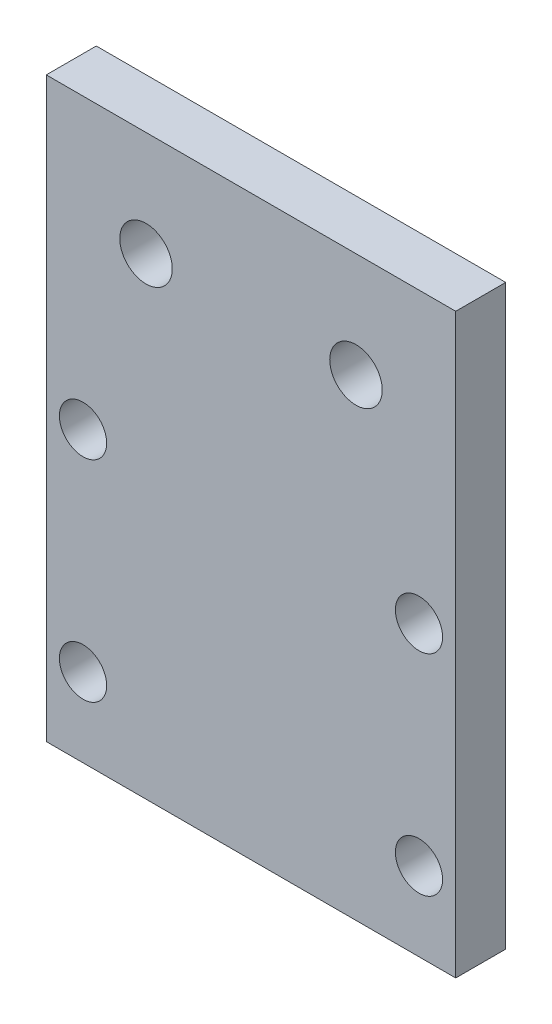
ISO-10303-21;
HEADER;
FILE_DESCRIPTION(('STEP AP214'),'2;1');
FILE_NAME('part.step','',(''),(''),'','','');
FILE_SCHEMA(('AUTOMOTIVE_DESIGN { 1 0 10303 214 1 1 1 1 }'));
ENDSEC;
DATA;
#1=APPLICATION_CONTEXT('core data for automotive mechanical design processes');
#2=APPLICATION_PROTOCOL_DEFINITION('international standard','automotive_design',2000,#1);
#3=PRODUCT_CONTEXT('',#1,'mechanical');
#4=PRODUCT('Part','Part','',(#3));
#5=PRODUCT_RELATED_PRODUCT_CATEGORY('part','',(#4));
#6=PRODUCT_DEFINITION_FORMATION('','',#4);
#7=PRODUCT_DEFINITION_CONTEXT('part definition',#1,'design');
#8=PRODUCT_DEFINITION('design','',#6,#7);
#9=PRODUCT_DEFINITION_SHAPE('','',#8);
#10=(LENGTH_UNIT() NAMED_UNIT(*) SI_UNIT(.MILLI.,.METRE.));
#11=(NAMED_UNIT(*) PLANE_ANGLE_UNIT() SI_UNIT($,.RADIAN.));
#12=(NAMED_UNIT(*) SI_UNIT($,.STERADIAN.) SOLID_ANGLE_UNIT());
#13=UNCERTAINTY_MEASURE_WITH_UNIT(LENGTH_MEASURE(1.E-05),#10,'distance_accuracy_value','');
#14=(GEOMETRIC_REPRESENTATION_CONTEXT(3) GLOBAL_UNCERTAINTY_ASSIGNED_CONTEXT((#13)) GLOBAL_UNIT_ASSIGNED_CONTEXT((#10,
#11,#12)) REPRESENTATION_CONTEXT('',''));
#15=CARTESIAN_POINT('',(0.,0.,0.));
#16=DIRECTION('',(0.,0.,1.));
#17=DIRECTION('',(1.,0.,0.));
#18=AXIS2_PLACEMENT_3D('',#15,#16,#17);
#19=CARTESIAN_POINT('',(35.5,0.,4.7625));
#20=DIRECTION('',(-1.,0.,0.));
#21=DIRECTION('',(0.,0.,1.));
#22=AXIS2_PLACEMENT_3D('',#19,#20,#21);
#23=PLANE('',#22);
#24=DIRECTION('',(0.,1.,0.));
#25=VECTOR('',#24,1.);
#26=CARTESIAN_POINT('',(35.5,0.,0.));
#27=LINE('',#26,#25);
#28=CARTESIAN_POINT('',(35.5,-7.5,0.));
#29=VERTEX_POINT('',#28);
#30=CARTESIAN_POINT('',(35.5,47.5,0.));
#31=VERTEX_POINT('',#30);
#32=EDGE_CURVE('E115',#29,#31,#27,.T.);
#33=ORIENTED_EDGE('',*,*,#32,.T.);
#34=DIRECTION('',(0.,0.,-1.));
#35=VECTOR('',#34,1.);
#36=CARTESIAN_POINT('',(35.5,47.5,4.7625));
#37=LINE('',#36,#35);
#38=CARTESIAN_POINT('',(35.5,47.5,4.7625));
#39=VERTEX_POINT('',#38);
#40=EDGE_CURVE('E11',#39,#31,#37,.T.);
#41=ORIENTED_EDGE('',*,*,#40,.F.);
#42=DIRECTION('',(0.,1.,0.));
#43=VECTOR('',#42,1.);
#44=CARTESIAN_POINT('',(35.5,0.,4.7625));
#45=LINE('',#44,#43);
#46=CARTESIAN_POINT('',(35.5,-7.5,4.7625));
#47=VERTEX_POINT('',#46);
#48=EDGE_CURVE('E74',#47,#39,#45,.T.);
#49=ORIENTED_EDGE('',*,*,#48,.F.);
#50=DIRECTION('',(0.,0.,-1.));
#51=VECTOR('',#50,1.);
#52=CARTESIAN_POINT('',(35.5,-7.5,4.7625));
#53=LINE('',#52,#51);
#54=EDGE_CURVE('E93',#47,#29,#53,.T.);
#55=ORIENTED_EDGE('',*,*,#54,.T.);
#56=EDGE_LOOP('',(#33,#41,#49,#55));
#57=FACE_BOUND('',#56,.T.);
#58=ADVANCED_FACE('F34',(#57),#23,.F.);
#59=CARTESIAN_POINT('',(0.,47.5,4.7625));
#60=DIRECTION('',(0.,1.,0.));
#61=DIRECTION('',(-1.,0.,0.));
#62=AXIS2_PLACEMENT_3D('',#59,#60,#61);
#63=PLANE('',#62);
#64=DIRECTION('',(1.,0.,0.));
#65=VECTOR('',#64,1.);
#66=CARTESIAN_POINT('',(0.,47.5,0.));
#67=LINE('',#66,#65);
#68=CARTESIAN_POINT('',(-3.50000000000001,47.5,0.));
#69=VERTEX_POINT('',#68);
#70=EDGE_CURVE('E83',#69,#31,#67,.T.);
#71=ORIENTED_EDGE('',*,*,#70,.F.);
#72=DIRECTION('',(0.,0.,-1.));
#73=VECTOR('',#72,1.);
#74=CARTESIAN_POINT('',(-3.50000000000001,47.5,4.7625));
#75=LINE('',#74,#73);
#76=CARTESIAN_POINT('',(-3.50000000000001,47.5,4.7625));
#77=VERTEX_POINT('',#76);
#78=EDGE_CURVE('E43',#77,#69,#75,.T.);
#79=ORIENTED_EDGE('',*,*,#78,.F.);
#80=DIRECTION('',(1.,0.,0.));
#81=VECTOR('',#80,1.);
#82=CARTESIAN_POINT('',(0.,47.5,4.7625));
#83=LINE('',#82,#81);
#84=EDGE_CURVE('E81',#77,#39,#83,.T.);
#85=ORIENTED_EDGE('',*,*,#84,.T.);
#86=ORIENTED_EDGE('',*,*,#40,.T.);
#87=EDGE_LOOP('',(#71,#79,#85,#86));
#88=FACE_BOUND('',#87,.T.);
#89=ADVANCED_FACE('F80',(#88),#63,.T.);
#90=CARTESIAN_POINT('',(-3.49999999999999,0.,4.7625));
#91=DIRECTION('',(-1.,0.,0.));
#92=DIRECTION('',(0.,-1.,0.));
#93=AXIS2_PLACEMENT_3D('',#90,#91,#92);
#94=PLANE('',#93);
#95=DIRECTION('',(0.,1.,0.));
#96=VECTOR('',#95,1.);
#97=CARTESIAN_POINT('',(-3.49999999999999,0.,0.));
#98=LINE('',#97,#96);
#99=CARTESIAN_POINT('',(-3.5,-7.5,0.));
#100=VERTEX_POINT('',#99);
#101=EDGE_CURVE('E119',#100,#69,#98,.T.);
#102=ORIENTED_EDGE('',*,*,#101,.F.);
#103=DIRECTION('',(0.,0.,-1.));
#104=VECTOR('',#103,1.);
#105=CARTESIAN_POINT('',(-3.5,-7.5,4.7625));
#106=LINE('',#105,#104);
#107=CARTESIAN_POINT('',(-3.5,-7.5,4.7625));
#108=VERTEX_POINT('',#107);
#109=EDGE_CURVE('E66',#108,#100,#106,.T.);
#110=ORIENTED_EDGE('',*,*,#109,.F.);
#111=DIRECTION('',(0.,1.,0.));
#112=VECTOR('',#111,1.);
#113=CARTESIAN_POINT('',(-3.49999999999999,0.,4.7625));
#114=LINE('',#113,#112);
#115=EDGE_CURVE('E89',#108,#77,#114,.T.);
#116=ORIENTED_EDGE('',*,*,#115,.T.);
#117=ORIENTED_EDGE('',*,*,#78,.T.);
#118=EDGE_LOOP('',(#102,#110,#116,#117));
#119=FACE_BOUND('',#118,.T.);
#120=ADVANCED_FACE('F91',(#119),#94,.T.);
#121=CARTESIAN_POINT('',(32.,20.,4.7625));
#122=DIRECTION('',(0.,0.,-1.));
#123=DIRECTION('',(-1.,0.,0.));
#124=AXIS2_PLACEMENT_3D('',#121,#122,#123);
#125=CYLINDRICAL_SURFACE('',#124,2.25);
#126=CARTESIAN_POINT('',(32.,20.,4.7625));
#127=DIRECTION('',(0.,0.,1.));
#128=DIRECTION('',(1.,0.,0.));
#129=AXIS2_PLACEMENT_3D('',#126,#127,#128);
#130=CIRCLE('',#129,2.25);
#131=CARTESIAN_POINT('',(29.75,20.,4.7625));
#132=VERTEX_POINT('',#131);
#133=EDGE_CURVE('E201',#132,#132,#130,.F.);
#134=CARTESIAN_POINT('',(32.,20.,0.));
#135=DIRECTION('',(0.,0.,1.));
#136=DIRECTION('',(1.,0.,0.));
#137=AXIS2_PLACEMENT_3D('',#134,#135,#136);
#138=CIRCLE('',#137,2.25);
#139=CARTESIAN_POINT('',(29.75,20.,0.));
#140=VERTEX_POINT('',#139);
#141=EDGE_CURVE('E112',#140,#140,#138,.F.);
#142=CARTESIAN_POINT('',(29.75,20.,4.7625));
#143=CARTESIAN_POINT('',(29.75,20.,4.712890625));
#144=CARTESIAN_POINT('',(29.75,20.,4.66328125));
#145=CARTESIAN_POINT('',(29.75,20.,4.5640625));
#146=CARTESIAN_POINT('',(29.75,20.,4.514453125));
#147=CARTESIAN_POINT('',(29.75,20.,4.415234375));
#148=CARTESIAN_POINT('',(29.75,20.,4.365625));
#149=CARTESIAN_POINT('',(29.75,20.,4.26640625));
#150=CARTESIAN_POINT('',(29.75,20.,4.216796875));
#151=CARTESIAN_POINT('',(29.75,20.,4.117578125));
#152=CARTESIAN_POINT('',(29.75,20.,4.06796875));
#153=CARTESIAN_POINT('',(29.75,20.,3.96875));
#154=CARTESIAN_POINT('',(29.75,20.,3.919140625));
#155=CARTESIAN_POINT('',(29.75,20.,3.819921875));
#156=CARTESIAN_POINT('',(29.75,20.,3.7703125));
#157=CARTESIAN_POINT('',(29.75,20.,3.67109375));
#158=CARTESIAN_POINT('',(29.75,20.,3.621484375));
#159=CARTESIAN_POINT('',(29.75,20.,3.522265625));
#160=CARTESIAN_POINT('',(29.75,20.,3.47265625));
#161=CARTESIAN_POINT('',(29.75,20.,3.3734375));
#162=CARTESIAN_POINT('',(29.75,20.,3.323828125));
#163=CARTESIAN_POINT('',(29.75,20.,3.224609375));
#164=CARTESIAN_POINT('',(29.75,20.,3.175));
#165=CARTESIAN_POINT('',(29.75,20.,3.07578125));
#166=CARTESIAN_POINT('',(29.75,20.,3.026171875));
#167=CARTESIAN_POINT('',(29.75,20.,2.926953125));
#168=CARTESIAN_POINT('',(29.75,20.,2.87734375));
#169=CARTESIAN_POINT('',(29.75,20.,2.778125));
#170=CARTESIAN_POINT('',(29.75,20.,2.728515625));
#171=CARTESIAN_POINT('',(29.75,20.,2.629296875));
#172=CARTESIAN_POINT('',(29.75,20.,2.5796875));
#173=CARTESIAN_POINT('',(29.75,20.,2.48046875));
#174=CARTESIAN_POINT('',(29.75,20.,2.430859375));
#175=CARTESIAN_POINT('',(29.75,20.,2.331640625));
#176=CARTESIAN_POINT('',(29.75,20.,2.28203125));
#177=CARTESIAN_POINT('',(29.75,20.,2.1828125));
#178=CARTESIAN_POINT('',(29.75,20.,2.133203125));
#179=CARTESIAN_POINT('',(29.75,20.,2.033984375));
#180=CARTESIAN_POINT('',(29.75,20.,1.984375));
#181=CARTESIAN_POINT('',(29.75,20.,1.88515625));
#182=CARTESIAN_POINT('',(29.75,20.,1.835546875));
#183=CARTESIAN_POINT('',(29.75,20.,1.736328125));
#184=CARTESIAN_POINT('',(29.75,20.,1.68671875));
#185=CARTESIAN_POINT('',(29.75,20.,1.5875));
#186=CARTESIAN_POINT('',(29.75,20.,1.537890625));
#187=CARTESIAN_POINT('',(29.75,20.,1.438671875));
#188=CARTESIAN_POINT('',(29.75,20.,1.3890625));
#189=CARTESIAN_POINT('',(29.75,20.,1.28984375));
#190=CARTESIAN_POINT('',(29.75,20.,1.240234375));
#191=CARTESIAN_POINT('',(29.75,20.,1.141015625));
#192=CARTESIAN_POINT('',(29.75,20.,1.09140625));
#193=CARTESIAN_POINT('',(29.75,20.,0.992187499999999));
#194=CARTESIAN_POINT('',(29.75,20.,0.942578124999999));
#195=CARTESIAN_POINT('',(29.75,20.,0.843359375));
#196=CARTESIAN_POINT('',(29.75,20.,0.79375));
#197=CARTESIAN_POINT('',(29.75,20.,0.69453125));
#198=CARTESIAN_POINT('',(29.75,20.,0.644921875));
#199=CARTESIAN_POINT('',(29.75,20.,0.545703125));
#200=CARTESIAN_POINT('',(29.75,20.,0.49609375));
#201=CARTESIAN_POINT('',(29.75,20.,0.396875));
#202=CARTESIAN_POINT('',(29.75,20.,0.347265625));
#203=CARTESIAN_POINT('',(29.75,20.,0.248046875));
#204=CARTESIAN_POINT('',(29.75,20.,0.1984375));
#205=CARTESIAN_POINT('',(29.75,20.,0.09921875));
#206=CARTESIAN_POINT('',(29.75,20.,0.049609375));
#207=CARTESIAN_POINT('',(29.75,20.,0.));
#208=B_SPLINE_CURVE_WITH_KNOTS('',3,(#142,#143,#144,#145,#146,#147,#148,#149,#150,#151,#152,
#153,#154,#155,#156,#157,#158,#159,#160,#161,#162,#163,#164,#165,#166,#167,#168,#169,#170,#171,
#172,#173,#174,#175,#176,#177,#178,#179,#180,#181,#182,#183,#184,#185,#186,#187,#188,#189,#190,
#191,#192,#193,#194,#195,#196,#197,#198,#199,#200,#201,#202,#203,#204,#205,#206,#207),
.UNSPECIFIED.,.F.,.F.,(4,2,2,2,2,2,2,2,2,2,2,2,2,2,2,2,2,2,2,2,2,2,2,2,2,2,2,2,2,2,2,2,4),(0.,
0.148828125,0.29765625,0.446484375,0.5953125,0.744140625,0.892968750000001,1.041796875,1.190625,
1.339453125,1.48828125,1.637109375,1.7859375,1.934765625,2.08359375,2.232421875,2.38125,
2.530078125,2.67890625,2.827734375,2.9765625,3.125390625,3.27421875,3.423046875,3.571875,
3.720703125,3.86953125,4.018359375,4.1671875,4.316015625,4.46484375,4.613671875,4.7625),.UNSPECIFIED.);
#209=EDGE_CURVE('BSEAM148',#132,#140,#208,.T.);
#210=ORIENTED_EDGE('',*,*,#133,.F.);
#211=ORIENTED_EDGE('',*,*,#141,.T.);
#212=ORIENTED_EDGE('',*,*,#209,.T.);
#213=ORIENTED_EDGE('',*,*,#209,.F.);
#214=EDGE_LOOP('',(#210,#212,#211,#213));
#215=FACE_BOUND('',#214,.T.);
#216=ADVANCED_FACE('F148',(#215),#125,.F.);
#217=CARTESIAN_POINT('',(32.,0.,4.7625));
#218=DIRECTION('',(0.,0.,-1.));
#219=DIRECTION('',(-1.,0.,0.));
#220=AXIS2_PLACEMENT_3D('',#217,#218,#219);
#221=CYLINDRICAL_SURFACE('',#220,2.25);
#222=CARTESIAN_POINT('',(32.,0.,4.7625));
#223=DIRECTION('',(0.,0.,1.));
#224=DIRECTION('',(1.,0.,0.));
#225=AXIS2_PLACEMENT_3D('',#222,#223,#224);
#226=CIRCLE('',#225,2.25);
#227=CARTESIAN_POINT('',(29.75,0.,4.7625));
#228=VERTEX_POINT('',#227);
#229=EDGE_CURVE('E198',#228,#228,#226,.T.);
#230=CARTESIAN_POINT('',(32.,0.,0.));
#231=DIRECTION('',(0.,0.,1.));
#232=DIRECTION('',(1.,0.,0.));
#233=AXIS2_PLACEMENT_3D('',#230,#231,#232);
#234=CIRCLE('',#233,2.25);
#235=CARTESIAN_POINT('',(29.75,0.,0.));
#236=VERTEX_POINT('',#235);
#237=EDGE_CURVE('E109',#236,#236,#234,.T.);
#238=CARTESIAN_POINT('',(29.75,0.,4.7625));
#239=CARTESIAN_POINT('',(29.75,0.,4.712890625));
#240=CARTESIAN_POINT('',(29.75,0.,4.66328125));
#241=CARTESIAN_POINT('',(29.75,0.,4.5640625));
#242=CARTESIAN_POINT('',(29.75,0.,4.514453125));
#243=CARTESIAN_POINT('',(29.75,0.,4.415234375));
#244=CARTESIAN_POINT('',(29.75,0.,4.365625));
#245=CARTESIAN_POINT('',(29.75,0.,4.26640625));
#246=CARTESIAN_POINT('',(29.75,0.,4.216796875));
#247=CARTESIAN_POINT('',(29.75,0.,4.117578125));
#248=CARTESIAN_POINT('',(29.75,0.,4.06796875));
#249=CARTESIAN_POINT('',(29.75,0.,3.96875));
#250=CARTESIAN_POINT('',(29.75,0.,3.919140625));
#251=CARTESIAN_POINT('',(29.75,0.,3.819921875));
#252=CARTESIAN_POINT('',(29.75,0.,3.7703125));
#253=CARTESIAN_POINT('',(29.75,0.,3.67109375));
#254=CARTESIAN_POINT('',(29.75,0.,3.621484375));
#255=CARTESIAN_POINT('',(29.75,0.,3.522265625));
#256=CARTESIAN_POINT('',(29.75,0.,3.47265625));
#257=CARTESIAN_POINT('',(29.75,0.,3.3734375));
#258=CARTESIAN_POINT('',(29.75,0.,3.323828125));
#259=CARTESIAN_POINT('',(29.75,0.,3.224609375));
#260=CARTESIAN_POINT('',(29.75,0.,3.175));
#261=CARTESIAN_POINT('',(29.75,0.,3.07578125));
#262=CARTESIAN_POINT('',(29.75,0.,3.026171875));
#263=CARTESIAN_POINT('',(29.75,0.,2.926953125));
#264=CARTESIAN_POINT('',(29.75,0.,2.87734375));
#265=CARTESIAN_POINT('',(29.75,0.,2.778125));
#266=CARTESIAN_POINT('',(29.75,0.,2.728515625));
#267=CARTESIAN_POINT('',(29.75,0.,2.629296875));
#268=CARTESIAN_POINT('',(29.75,0.,2.5796875));
#269=CARTESIAN_POINT('',(29.75,0.,2.48046875));
#270=CARTESIAN_POINT('',(29.75,0.,2.430859375));
#271=CARTESIAN_POINT('',(29.75,0.,2.331640625));
#272=CARTESIAN_POINT('',(29.75,0.,2.28203125));
#273=CARTESIAN_POINT('',(29.75,0.,2.1828125));
#274=CARTESIAN_POINT('',(29.75,0.,2.133203125));
#275=CARTESIAN_POINT('',(29.75,0.,2.033984375));
#276=CARTESIAN_POINT('',(29.75,0.,1.984375));
#277=CARTESIAN_POINT('',(29.75,0.,1.88515625));
#278=CARTESIAN_POINT('',(29.75,0.,1.835546875));
#279=CARTESIAN_POINT('',(29.75,0.,1.736328125));
#280=CARTESIAN_POINT('',(29.75,0.,1.68671875));
#281=CARTESIAN_POINT('',(29.75,0.,1.5875));
#282=CARTESIAN_POINT('',(29.75,0.,1.537890625));
#283=CARTESIAN_POINT('',(29.75,0.,1.438671875));
#284=CARTESIAN_POINT('',(29.75,0.,1.3890625));
#285=CARTESIAN_POINT('',(29.75,0.,1.28984375));
#286=CARTESIAN_POINT('',(29.75,0.,1.240234375));
#287=CARTESIAN_POINT('',(29.75,0.,1.141015625));
#288=CARTESIAN_POINT('',(29.75,0.,1.09140625));
#289=CARTESIAN_POINT('',(29.75,0.,0.992187499999999));
#290=CARTESIAN_POINT('',(29.75,0.,0.942578124999999));
#291=CARTESIAN_POINT('',(29.75,0.,0.843359375));
#292=CARTESIAN_POINT('',(29.75,0.,0.79375));
#293=CARTESIAN_POINT('',(29.75,0.,0.69453125));
#294=CARTESIAN_POINT('',(29.75,0.,0.644921875));
#295=CARTESIAN_POINT('',(29.75,0.,0.545703125));
#296=CARTESIAN_POINT('',(29.75,0.,0.49609375));
#297=CARTESIAN_POINT('',(29.75,0.,0.396875));
#298=CARTESIAN_POINT('',(29.75,0.,0.347265625));
#299=CARTESIAN_POINT('',(29.75,0.,0.248046875));
#300=CARTESIAN_POINT('',(29.75,0.,0.1984375));
#301=CARTESIAN_POINT('',(29.75,0.,0.09921875));
#302=CARTESIAN_POINT('',(29.75,0.,0.049609375));
#303=CARTESIAN_POINT('',(29.75,0.,0.));
#304=B_SPLINE_CURVE_WITH_KNOTS('',3,(#238,#239,#240,#241,#242,#243,#244,#245,#246,#247,#248,
#249,#250,#251,#252,#253,#254,#255,#256,#257,#258,#259,#260,#261,#262,#263,#264,#265,#266,#267,
#268,#269,#270,#271,#272,#273,#274,#275,#276,#277,#278,#279,#280,#281,#282,#283,#284,#285,#286,
#287,#288,#289,#290,#291,#292,#293,#294,#295,#296,#297,#298,#299,#300,#301,#302,#303),
.UNSPECIFIED.,.F.,.F.,(4,2,2,2,2,2,2,2,2,2,2,2,2,2,2,2,2,2,2,2,2,2,2,2,2,2,2,2,2,2,2,2,4),(0.,
0.148828125,0.29765625,0.446484375,0.5953125,0.744140625,0.892968750000001,1.041796875,1.190625,
1.339453125,1.48828125,1.637109375,1.7859375,1.934765625,2.08359375,2.232421875,2.38125,
2.530078125,2.67890625,2.827734375,2.9765625,3.125390625,3.27421875,3.423046875,3.571875,
3.720703125,3.86953125,4.018359375,4.1671875,4.316015625,4.46484375,4.613671875,4.7625),.UNSPECIFIED.);
#305=EDGE_CURVE('BSEAM151',#228,#236,#304,.T.);
#306=ORIENTED_EDGE('',*,*,#229,.T.);
#307=ORIENTED_EDGE('',*,*,#237,.F.);
#308=ORIENTED_EDGE('',*,*,#305,.T.);
#309=ORIENTED_EDGE('',*,*,#305,.F.);
#310=EDGE_LOOP('',(#306,#308,#307,#309));
#311=FACE_BOUND('',#310,.T.);
#312=ADVANCED_FACE('F151',(#311),#221,.F.);
#313=CARTESIAN_POINT('',(0.,0.,4.7625));
#314=DIRECTION('',(0.,0.,-1.));
#315=DIRECTION('',(-1.,0.,0.));
#316=AXIS2_PLACEMENT_3D('',#313,#314,#315);
#317=CYLINDRICAL_SURFACE('',#316,2.25);
#318=CARTESIAN_POINT('',(0.,0.,4.7625));
#319=DIRECTION('',(0.,0.,1.));
#320=DIRECTION('',(1.,0.,0.));
#321=AXIS2_PLACEMENT_3D('',#318,#319,#320);
#322=CIRCLE('',#321,2.25);
#323=CARTESIAN_POINT('',(-2.25,0.,4.7625));
#324=VERTEX_POINT('',#323);
#325=EDGE_CURVE('E191',#324,#324,#322,.T.);
#326=CARTESIAN_POINT('',(0.,0.,0.));
#327=DIRECTION('',(0.,0.,1.));
#328=DIRECTION('',(1.,0.,0.));
#329=AXIS2_PLACEMENT_3D('',#326,#327,#328);
#330=CIRCLE('',#329,2.25);
#331=CARTESIAN_POINT('',(-2.25,0.,0.));
#332=VERTEX_POINT('',#331);
#333=EDGE_CURVE('E106',#332,#332,#330,.T.);
#334=CARTESIAN_POINT('',(-2.25,0.,4.7625));
#335=CARTESIAN_POINT('',(-2.25,0.,4.712890625));
#336=CARTESIAN_POINT('',(-2.25,0.,4.66328125));
#337=CARTESIAN_POINT('',(-2.25,0.,4.5640625));
#338=CARTESIAN_POINT('',(-2.25,0.,4.514453125));
#339=CARTESIAN_POINT('',(-2.25,0.,4.415234375));
#340=CARTESIAN_POINT('',(-2.25,0.,4.365625));
#341=CARTESIAN_POINT('',(-2.25,0.,4.26640625));
#342=CARTESIAN_POINT('',(-2.25,0.,4.216796875));
#343=CARTESIAN_POINT('',(-2.25,0.,4.117578125));
#344=CARTESIAN_POINT('',(-2.25,0.,4.06796875));
#345=CARTESIAN_POINT('',(-2.25,0.,3.96875));
#346=CARTESIAN_POINT('',(-2.25,0.,3.919140625));
#347=CARTESIAN_POINT('',(-2.25,0.,3.819921875));
#348=CARTESIAN_POINT('',(-2.25,0.,3.7703125));
#349=CARTESIAN_POINT('',(-2.25,0.,3.67109375));
#350=CARTESIAN_POINT('',(-2.25,0.,3.621484375));
#351=CARTESIAN_POINT('',(-2.25,0.,3.522265625));
#352=CARTESIAN_POINT('',(-2.25,0.,3.47265625));
#353=CARTESIAN_POINT('',(-2.25,0.,3.3734375));
#354=CARTESIAN_POINT('',(-2.25,0.,3.323828125));
#355=CARTESIAN_POINT('',(-2.25,0.,3.224609375));
#356=CARTESIAN_POINT('',(-2.25,0.,3.175));
#357=CARTESIAN_POINT('',(-2.25,0.,3.07578125));
#358=CARTESIAN_POINT('',(-2.25,0.,3.026171875));
#359=CARTESIAN_POINT('',(-2.25,0.,2.926953125));
#360=CARTESIAN_POINT('',(-2.25,0.,2.87734375));
#361=CARTESIAN_POINT('',(-2.25,0.,2.778125));
#362=CARTESIAN_POINT('',(-2.25,0.,2.728515625));
#363=CARTESIAN_POINT('',(-2.25,0.,2.629296875));
#364=CARTESIAN_POINT('',(-2.25,0.,2.5796875));
#365=CARTESIAN_POINT('',(-2.25,0.,2.48046875));
#366=CARTESIAN_POINT('',(-2.25,0.,2.430859375));
#367=CARTESIAN_POINT('',(-2.25,0.,2.331640625));
#368=CARTESIAN_POINT('',(-2.25,0.,2.28203125));
#369=CARTESIAN_POINT('',(-2.25,0.,2.1828125));
#370=CARTESIAN_POINT('',(-2.25,0.,2.133203125));
#371=CARTESIAN_POINT('',(-2.25,0.,2.033984375));
#372=CARTESIAN_POINT('',(-2.25,0.,1.984375));
#373=CARTESIAN_POINT('',(-2.25,0.,1.88515625));
#374=CARTESIAN_POINT('',(-2.25,0.,1.835546875));
#375=CARTESIAN_POINT('',(-2.25,0.,1.736328125));
#376=CARTESIAN_POINT('',(-2.25,0.,1.68671875));
#377=CARTESIAN_POINT('',(-2.25,0.,1.5875));
#378=CARTESIAN_POINT('',(-2.25,0.,1.537890625));
#379=CARTESIAN_POINT('',(-2.25,0.,1.438671875));
#380=CARTESIAN_POINT('',(-2.25,0.,1.3890625));
#381=CARTESIAN_POINT('',(-2.25,0.,1.28984375));
#382=CARTESIAN_POINT('',(-2.25,0.,1.240234375));
#383=CARTESIAN_POINT('',(-2.25,0.,1.141015625));
#384=CARTESIAN_POINT('',(-2.25,0.,1.09140625));
#385=CARTESIAN_POINT('',(-2.25,0.,0.992187499999999));
#386=CARTESIAN_POINT('',(-2.25,0.,0.942578124999999));
#387=CARTESIAN_POINT('',(-2.25,0.,0.843359375));
#388=CARTESIAN_POINT('',(-2.25,0.,0.79375));
#389=CARTESIAN_POINT('',(-2.25,0.,0.69453125));
#390=CARTESIAN_POINT('',(-2.25,0.,0.644921875));
#391=CARTESIAN_POINT('',(-2.25,0.,0.545703125));
#392=CARTESIAN_POINT('',(-2.25,0.,0.49609375));
#393=CARTESIAN_POINT('',(-2.25,0.,0.396875));
#394=CARTESIAN_POINT('',(-2.25,0.,0.347265625));
#395=CARTESIAN_POINT('',(-2.25,0.,0.248046875));
#396=CARTESIAN_POINT('',(-2.25,0.,0.1984375));
#397=CARTESIAN_POINT('',(-2.25,0.,0.09921875));
#398=CARTESIAN_POINT('',(-2.25,0.,0.049609375));
#399=CARTESIAN_POINT('',(-2.25,0.,0.));
#400=B_SPLINE_CURVE_WITH_KNOTS('',3,(#334,#335,#336,#337,#338,#339,#340,#341,#342,#343,#344,
#345,#346,#347,#348,#349,#350,#351,#352,#353,#354,#355,#356,#357,#358,#359,#360,#361,#362,#363,
#364,#365,#366,#367,#368,#369,#370,#371,#372,#373,#374,#375,#376,#377,#378,#379,#380,#381,#382,
#383,#384,#385,#386,#387,#388,#389,#390,#391,#392,#393,#394,#395,#396,#397,#398,#399),
.UNSPECIFIED.,.F.,.F.,(4,2,2,2,2,2,2,2,2,2,2,2,2,2,2,2,2,2,2,2,2,2,2,2,2,2,2,2,2,2,2,2,4),(0.,
0.148828125,0.29765625,0.446484375,0.5953125,0.744140625,0.892968750000001,1.041796875,1.190625,
1.339453125,1.48828125,1.637109375,1.7859375,1.934765625,2.08359375,2.232421875,2.38125,
2.530078125,2.67890625,2.827734375,2.9765625,3.125390625,3.27421875,3.423046875,3.571875,
3.720703125,3.86953125,4.018359375,4.1671875,4.316015625,4.46484375,4.613671875,4.7625),.UNSPECIFIED.);
#401=EDGE_CURVE('BSEAM155',#324,#332,#400,.T.);
#402=ORIENTED_EDGE('',*,*,#325,.T.);
#403=ORIENTED_EDGE('',*,*,#333,.F.);
#404=ORIENTED_EDGE('',*,*,#401,.T.);
#405=ORIENTED_EDGE('',*,*,#401,.F.);
#406=EDGE_LOOP('',(#402,#404,#403,#405));
#407=FACE_BOUND('',#406,.T.);
#408=ADVANCED_FACE('F155',(#407),#317,.F.);
#409=CARTESIAN_POINT('',(0.,20.,4.7625));
#410=DIRECTION('',(0.,0.,-1.));
#411=DIRECTION('',(-1.,0.,0.));
#412=AXIS2_PLACEMENT_3D('',#409,#410,#411);
#413=CYLINDRICAL_SURFACE('',#412,2.25);
#414=CARTESIAN_POINT('',(0.,20.,4.7625));
#415=DIRECTION('',(0.,0.,1.));
#416=DIRECTION('',(1.,0.,0.));
#417=AXIS2_PLACEMENT_3D('',#414,#415,#416);
#418=CIRCLE('',#417,2.25);
#419=CARTESIAN_POINT('',(-2.25,20.,4.7625));
#420=VERTEX_POINT('',#419);
#421=EDGE_CURVE('E188',#420,#420,#418,.F.);
#422=CARTESIAN_POINT('',(0.,20.,0.));
#423=DIRECTION('',(0.,0.,1.));
#424=DIRECTION('',(1.,0.,0.));
#425=AXIS2_PLACEMENT_3D('',#422,#423,#424);
#426=CIRCLE('',#425,2.25);
#427=CARTESIAN_POINT('',(-2.25,20.,0.));
#428=VERTEX_POINT('',#427);
#429=EDGE_CURVE('E103',#428,#428,#426,.F.);
#430=CARTESIAN_POINT('',(-2.25,20.,4.7625));
#431=CARTESIAN_POINT('',(-2.25,20.,4.712890625));
#432=CARTESIAN_POINT('',(-2.25,20.,4.66328125));
#433=CARTESIAN_POINT('',(-2.25,20.,4.5640625));
#434=CARTESIAN_POINT('',(-2.25,20.,4.514453125));
#435=CARTESIAN_POINT('',(-2.25,20.,4.415234375));
#436=CARTESIAN_POINT('',(-2.25,20.,4.365625));
#437=CARTESIAN_POINT('',(-2.25,20.,4.26640625));
#438=CARTESIAN_POINT('',(-2.25,20.,4.216796875));
#439=CARTESIAN_POINT('',(-2.25,20.,4.117578125));
#440=CARTESIAN_POINT('',(-2.25,20.,4.06796875));
#441=CARTESIAN_POINT('',(-2.25,20.,3.96875));
#442=CARTESIAN_POINT('',(-2.25,20.,3.919140625));
#443=CARTESIAN_POINT('',(-2.25,20.,3.819921875));
#444=CARTESIAN_POINT('',(-2.25,20.,3.7703125));
#445=CARTESIAN_POINT('',(-2.25,20.,3.67109375));
#446=CARTESIAN_POINT('',(-2.25,20.,3.621484375));
#447=CARTESIAN_POINT('',(-2.25,20.,3.522265625));
#448=CARTESIAN_POINT('',(-2.25,20.,3.47265625));
#449=CARTESIAN_POINT('',(-2.25,20.,3.3734375));
#450=CARTESIAN_POINT('',(-2.25,20.,3.323828125));
#451=CARTESIAN_POINT('',(-2.25,20.,3.224609375));
#452=CARTESIAN_POINT('',(-2.25,20.,3.175));
#453=CARTESIAN_POINT('',(-2.25,20.,3.07578125));
#454=CARTESIAN_POINT('',(-2.25,20.,3.026171875));
#455=CARTESIAN_POINT('',(-2.25,20.,2.926953125));
#456=CARTESIAN_POINT('',(-2.25,20.,2.87734375));
#457=CARTESIAN_POINT('',(-2.25,20.,2.778125));
#458=CARTESIAN_POINT('',(-2.25,20.,2.728515625));
#459=CARTESIAN_POINT('',(-2.25,20.,2.629296875));
#460=CARTESIAN_POINT('',(-2.25,20.,2.5796875));
#461=CARTESIAN_POINT('',(-2.25,20.,2.48046875));
#462=CARTESIAN_POINT('',(-2.25,20.,2.430859375));
#463=CARTESIAN_POINT('',(-2.25,20.,2.331640625));
#464=CARTESIAN_POINT('',(-2.25,20.,2.28203125));
#465=CARTESIAN_POINT('',(-2.25,20.,2.1828125));
#466=CARTESIAN_POINT('',(-2.25,20.,2.133203125));
#467=CARTESIAN_POINT('',(-2.25,20.,2.033984375));
#468=CARTESIAN_POINT('',(-2.25,20.,1.984375));
#469=CARTESIAN_POINT('',(-2.25,20.,1.88515625));
#470=CARTESIAN_POINT('',(-2.25,20.,1.835546875));
#471=CARTESIAN_POINT('',(-2.25,20.,1.736328125));
#472=CARTESIAN_POINT('',(-2.25,20.,1.68671875));
#473=CARTESIAN_POINT('',(-2.25,20.,1.5875));
#474=CARTESIAN_POINT('',(-2.25,20.,1.537890625));
#475=CARTESIAN_POINT('',(-2.25,20.,1.438671875));
#476=CARTESIAN_POINT('',(-2.25,20.,1.3890625));
#477=CARTESIAN_POINT('',(-2.25,20.,1.28984375));
#478=CARTESIAN_POINT('',(-2.25,20.,1.240234375));
#479=CARTESIAN_POINT('',(-2.25,20.,1.141015625));
#480=CARTESIAN_POINT('',(-2.25,20.,1.09140625));
#481=CARTESIAN_POINT('',(-2.25,20.,0.992187499999999));
#482=CARTESIAN_POINT('',(-2.25,20.,0.942578124999999));
#483=CARTESIAN_POINT('',(-2.25,20.,0.843359375));
#484=CARTESIAN_POINT('',(-2.25,20.,0.79375));
#485=CARTESIAN_POINT('',(-2.25,20.,0.69453125));
#486=CARTESIAN_POINT('',(-2.25,20.,0.644921875));
#487=CARTESIAN_POINT('',(-2.25,20.,0.545703125));
#488=CARTESIAN_POINT('',(-2.25,20.,0.49609375));
#489=CARTESIAN_POINT('',(-2.25,20.,0.396875));
#490=CARTESIAN_POINT('',(-2.25,20.,0.347265625));
#491=CARTESIAN_POINT('',(-2.25,20.,0.248046875));
#492=CARTESIAN_POINT('',(-2.25,20.,0.1984375));
#493=CARTESIAN_POINT('',(-2.25,20.,0.09921875));
#494=CARTESIAN_POINT('',(-2.25,20.,0.049609375));
#495=CARTESIAN_POINT('',(-2.25,20.,0.));
#496=B_SPLINE_CURVE_WITH_KNOTS('',3,(#430,#431,#432,#433,#434,#435,#436,#437,#438,#439,#440,
#441,#442,#443,#444,#445,#446,#447,#448,#449,#450,#451,#452,#453,#454,#455,#456,#457,#458,#459,
#460,#461,#462,#463,#464,#465,#466,#467,#468,#469,#470,#471,#472,#473,#474,#475,#476,#477,#478,
#479,#480,#481,#482,#483,#484,#485,#486,#487,#488,#489,#490,#491,#492,#493,#494,#495),
.UNSPECIFIED.,.F.,.F.,(4,2,2,2,2,2,2,2,2,2,2,2,2,2,2,2,2,2,2,2,2,2,2,2,2,2,2,2,2,2,2,2,4),(0.,
0.148828125,0.29765625,0.446484375,0.5953125,0.744140625,0.892968750000001,1.041796875,1.190625,
1.339453125,1.48828125,1.637109375,1.7859375,1.934765625,2.08359375,2.232421875,2.38125,
2.530078125,2.67890625,2.827734375,2.9765625,3.125390625,3.27421875,3.423046875,3.571875,
3.720703125,3.86953125,4.018359375,4.1671875,4.316015625,4.46484375,4.613671875,4.7625),.UNSPECIFIED.);
#497=EDGE_CURVE('BSEAM159',#420,#428,#496,.T.);
#498=ORIENTED_EDGE('',*,*,#421,.F.);
#499=ORIENTED_EDGE('',*,*,#429,.T.);
#500=ORIENTED_EDGE('',*,*,#497,.T.);
#501=ORIENTED_EDGE('',*,*,#497,.F.);
#502=EDGE_LOOP('',(#498,#500,#499,#501));
#503=FACE_BOUND('',#502,.T.);
#504=ADVANCED_FACE('F159',(#503),#413,.F.);
#505=CARTESIAN_POINT('',(5.99999999999999,37.5,4.7625));
#506=DIRECTION('',(0.,0.,-1.));
#507=DIRECTION('',(-1.,0.,0.));
#508=AXIS2_PLACEMENT_3D('',#505,#506,#507);
#509=CYLINDRICAL_SURFACE('',#508,2.5);
#510=CARTESIAN_POINT('',(5.99999999999999,37.5,4.7625));
#511=DIRECTION('',(0.,0.,1.));
#512=DIRECTION('',(1.,0.,0.));
#513=AXIS2_PLACEMENT_3D('',#510,#511,#512);
#514=CIRCLE('',#513,2.5);
#515=CARTESIAN_POINT('',(3.49999999999999,37.5,4.7625));
#516=VERTEX_POINT('',#515);
#517=EDGE_CURVE('E173',#516,#516,#514,.T.);
#518=CARTESIAN_POINT('',(5.99999999999999,37.5,0.));
#519=DIRECTION('',(0.,0.,1.));
#520=DIRECTION('',(1.,0.,0.));
#521=AXIS2_PLACEMENT_3D('',#518,#519,#520);
#522=CIRCLE('',#521,2.5);
#523=CARTESIAN_POINT('',(3.49999999999999,37.5,0.));
#524=VERTEX_POINT('',#523);
#525=EDGE_CURVE('E100',#524,#524,#522,.T.);
#526=CARTESIAN_POINT('',(3.49999999999999,37.5,4.7625));
#527=CARTESIAN_POINT('',(3.49999999999999,37.5,4.712890625));
#528=CARTESIAN_POINT('',(3.49999999999999,37.5,4.66328125));
#529=CARTESIAN_POINT('',(3.49999999999999,37.5,4.5640625));
#530=CARTESIAN_POINT('',(3.49999999999999,37.5,4.514453125));
#531=CARTESIAN_POINT('',(3.49999999999999,37.5,4.415234375));
#532=CARTESIAN_POINT('',(3.49999999999999,37.5,4.365625));
#533=CARTESIAN_POINT('',(3.49999999999999,37.5,4.26640625));
#534=CARTESIAN_POINT('',(3.49999999999999,37.5,4.216796875));
#535=CARTESIAN_POINT('',(3.49999999999999,37.5,4.117578125));
#536=CARTESIAN_POINT('',(3.49999999999999,37.5,4.06796875));
#537=CARTESIAN_POINT('',(3.49999999999999,37.5,3.96875));
#538=CARTESIAN_POINT('',(3.49999999999999,37.5,3.919140625));
#539=CARTESIAN_POINT('',(3.49999999999999,37.5,3.819921875));
#540=CARTESIAN_POINT('',(3.49999999999999,37.5,3.7703125));
#541=CARTESIAN_POINT('',(3.49999999999999,37.5,3.67109375));
#542=CARTESIAN_POINT('',(3.49999999999999,37.5,3.621484375));
#543=CARTESIAN_POINT('',(3.49999999999999,37.5,3.522265625));
#544=CARTESIAN_POINT('',(3.49999999999999,37.5,3.47265625));
#545=CARTESIAN_POINT('',(3.49999999999999,37.5,3.3734375));
#546=CARTESIAN_POINT('',(3.49999999999999,37.5,3.323828125));
#547=CARTESIAN_POINT('',(3.49999999999999,37.5,3.224609375));
#548=CARTESIAN_POINT('',(3.49999999999999,37.5,3.175));
#549=CARTESIAN_POINT('',(3.49999999999999,37.5,3.07578125));
#550=CARTESIAN_POINT('',(3.49999999999999,37.5,3.026171875));
#551=CARTESIAN_POINT('',(3.49999999999999,37.5,2.926953125));
#552=CARTESIAN_POINT('',(3.49999999999999,37.5,2.87734375));
#553=CARTESIAN_POINT('',(3.49999999999999,37.5,2.778125));
#554=CARTESIAN_POINT('',(3.49999999999999,37.5,2.728515625));
#555=CARTESIAN_POINT('',(3.49999999999999,37.5,2.629296875));
#556=CARTESIAN_POINT('',(3.49999999999999,37.5,2.5796875));
#557=CARTESIAN_POINT('',(3.49999999999999,37.5,2.48046875));
#558=CARTESIAN_POINT('',(3.49999999999999,37.5,2.430859375));
#559=CARTESIAN_POINT('',(3.49999999999999,37.5,2.331640625));
#560=CARTESIAN_POINT('',(3.49999999999999,37.5,2.28203125));
#561=CARTESIAN_POINT('',(3.49999999999999,37.5,2.1828125));
#562=CARTESIAN_POINT('',(3.49999999999999,37.5,2.133203125));
#563=CARTESIAN_POINT('',(3.49999999999999,37.5,2.033984375));
#564=CARTESIAN_POINT('',(3.49999999999999,37.5,1.984375));
#565=CARTESIAN_POINT('',(3.49999999999999,37.5,1.88515625));
#566=CARTESIAN_POINT('',(3.49999999999999,37.5,1.835546875));
#567=CARTESIAN_POINT('',(3.49999999999999,37.5,1.736328125));
#568=CARTESIAN_POINT('',(3.49999999999999,37.5,1.68671875));
#569=CARTESIAN_POINT('',(3.49999999999999,37.5,1.5875));
#570=CARTESIAN_POINT('',(3.49999999999999,37.5,1.537890625));
#571=CARTESIAN_POINT('',(3.49999999999999,37.5,1.438671875));
#572=CARTESIAN_POINT('',(3.49999999999999,37.5,1.3890625));
#573=CARTESIAN_POINT('',(3.49999999999999,37.5,1.28984375));
#574=CARTESIAN_POINT('',(3.49999999999999,37.5,1.240234375));
#575=CARTESIAN_POINT('',(3.49999999999999,37.5,1.141015625));
#576=CARTESIAN_POINT('',(3.49999999999999,37.5,1.09140625));
#577=CARTESIAN_POINT('',(3.49999999999999,37.5,0.992187499999999));
#578=CARTESIAN_POINT('',(3.49999999999999,37.5,0.942578124999999));
#579=CARTESIAN_POINT('',(3.49999999999999,37.5,0.843359375));
#580=CARTESIAN_POINT('',(3.49999999999999,37.5,0.79375));
#581=CARTESIAN_POINT('',(3.49999999999999,37.5,0.69453125));
#582=CARTESIAN_POINT('',(3.49999999999999,37.5,0.644921875));
#583=CARTESIAN_POINT('',(3.49999999999999,37.5,0.545703125));
#584=CARTESIAN_POINT('',(3.49999999999999,37.5,0.49609375));
#585=CARTESIAN_POINT('',(3.49999999999999,37.5,0.396875));
#586=CARTESIAN_POINT('',(3.49999999999999,37.5,0.347265625));
#587=CARTESIAN_POINT('',(3.49999999999999,37.5,0.248046875));
#588=CARTESIAN_POINT('',(3.49999999999999,37.5,0.1984375));
#589=CARTESIAN_POINT('',(3.49999999999999,37.5,0.09921875));
#590=CARTESIAN_POINT('',(3.49999999999999,37.5,0.049609375));
#591=CARTESIAN_POINT('',(3.49999999999999,37.5,0.));
#592=B_SPLINE_CURVE_WITH_KNOTS('',3,(#526,#527,#528,#529,#530,#531,#532,#533,#534,#535,#536,
#537,#538,#539,#540,#541,#542,#543,#544,#545,#546,#547,#548,#549,#550,#551,#552,#553,#554,#555,
#556,#557,#558,#559,#560,#561,#562,#563,#564,#565,#566,#567,#568,#569,#570,#571,#572,#573,#574,
#575,#576,#577,#578,#579,#580,#581,#582,#583,#584,#585,#586,#587,#588,#589,#590,#591),
.UNSPECIFIED.,.F.,.F.,(4,2,2,2,2,2,2,2,2,2,2,2,2,2,2,2,2,2,2,2,2,2,2,2,2,2,2,2,2,2,2,2,4),(0.,
0.148828125,0.29765625,0.446484375,0.5953125,0.744140625,0.892968750000001,1.041796875,1.190625,
1.339453125,1.48828125,1.637109375,1.7859375,1.934765625,2.08359375,2.232421875,2.38125,
2.530078125,2.67890625,2.827734375,2.9765625,3.125390625,3.27421875,3.423046875,3.571875,
3.720703125,3.86953125,4.018359375,4.1671875,4.316015625,4.46484375,4.613671875,4.7625),.UNSPECIFIED.);
#593=EDGE_CURVE('BSEAM162',#516,#524,#592,.T.);
#594=ORIENTED_EDGE('',*,*,#517,.T.);
#595=ORIENTED_EDGE('',*,*,#525,.F.);
#596=ORIENTED_EDGE('',*,*,#593,.T.);
#597=ORIENTED_EDGE('',*,*,#593,.F.);
#598=EDGE_LOOP('',(#594,#596,#595,#597));
#599=FACE_BOUND('',#598,.T.);
#600=ADVANCED_FACE('F162',(#599),#509,.F.);
#601=CARTESIAN_POINT('',(26.,37.5,4.7625));
#602=DIRECTION('',(0.,0.,-1.));
#603=DIRECTION('',(-1.,0.,0.));
#604=AXIS2_PLACEMENT_3D('',#601,#602,#603);
#605=CYLINDRICAL_SURFACE('',#604,2.5);
#606=CARTESIAN_POINT('',(26.,37.5,4.7625));
#607=DIRECTION('',(0.,0.,1.));
#608=DIRECTION('',(1.,0.,0.));
#609=AXIS2_PLACEMENT_3D('',#606,#607,#608);
#610=CIRCLE('',#609,2.5);
#611=CARTESIAN_POINT('',(23.5,37.5,4.7625));
#612=VERTEX_POINT('',#611);
#613=EDGE_CURVE('E122',#612,#612,#610,.F.);
#614=CARTESIAN_POINT('',(26.,37.5,0.));
#615=DIRECTION('',(0.,0.,1.));
#616=DIRECTION('',(1.,0.,0.));
#617=AXIS2_PLACEMENT_3D('',#614,#615,#616);
#618=CIRCLE('',#617,2.5);
#619=CARTESIAN_POINT('',(23.5,37.5,0.));
#620=VERTEX_POINT('',#619);
#621=EDGE_CURVE('E97',#620,#620,#618,.F.);
#622=CARTESIAN_POINT('',(23.5,37.5,4.7625));
#623=CARTESIAN_POINT('',(23.5,37.5,4.712890625));
#624=CARTESIAN_POINT('',(23.5,37.5,4.66328125));
#625=CARTESIAN_POINT('',(23.5,37.5,4.5640625));
#626=CARTESIAN_POINT('',(23.5,37.5,4.514453125));
#627=CARTESIAN_POINT('',(23.5,37.5,4.415234375));
#628=CARTESIAN_POINT('',(23.5,37.5,4.365625));
#629=CARTESIAN_POINT('',(23.5,37.5,4.26640625));
#630=CARTESIAN_POINT('',(23.5,37.5,4.216796875));
#631=CARTESIAN_POINT('',(23.5,37.5,4.117578125));
#632=CARTESIAN_POINT('',(23.5,37.5,4.06796875));
#633=CARTESIAN_POINT('',(23.5,37.5,3.96875));
#634=CARTESIAN_POINT('',(23.5,37.5,3.919140625));
#635=CARTESIAN_POINT('',(23.5,37.5,3.819921875));
#636=CARTESIAN_POINT('',(23.5,37.5,3.7703125));
#637=CARTESIAN_POINT('',(23.5,37.5,3.67109375));
#638=CARTESIAN_POINT('',(23.5,37.5,3.621484375));
#639=CARTESIAN_POINT('',(23.5,37.5,3.522265625));
#640=CARTESIAN_POINT('',(23.5,37.5,3.47265625));
#641=CARTESIAN_POINT('',(23.5,37.5,3.3734375));
#642=CARTESIAN_POINT('',(23.5,37.5,3.323828125));
#643=CARTESIAN_POINT('',(23.5,37.5,3.224609375));
#644=CARTESIAN_POINT('',(23.5,37.5,3.175));
#645=CARTESIAN_POINT('',(23.5,37.5,3.07578125));
#646=CARTESIAN_POINT('',(23.5,37.5,3.026171875));
#647=CARTESIAN_POINT('',(23.5,37.5,2.926953125));
#648=CARTESIAN_POINT('',(23.5,37.5,2.87734375));
#649=CARTESIAN_POINT('',(23.5,37.5,2.778125));
#650=CARTESIAN_POINT('',(23.5,37.5,2.728515625));
#651=CARTESIAN_POINT('',(23.5,37.5,2.629296875));
#652=CARTESIAN_POINT('',(23.5,37.5,2.5796875));
#653=CARTESIAN_POINT('',(23.5,37.5,2.48046875));
#654=CARTESIAN_POINT('',(23.5,37.5,2.430859375));
#655=CARTESIAN_POINT('',(23.5,37.5,2.331640625));
#656=CARTESIAN_POINT('',(23.5,37.5,2.28203125));
#657=CARTESIAN_POINT('',(23.5,37.5,2.1828125));
#658=CARTESIAN_POINT('',(23.5,37.5,2.133203125));
#659=CARTESIAN_POINT('',(23.5,37.5,2.033984375));
#660=CARTESIAN_POINT('',(23.5,37.5,1.984375));
#661=CARTESIAN_POINT('',(23.5,37.5,1.88515625));
#662=CARTESIAN_POINT('',(23.5,37.5,1.835546875));
#663=CARTESIAN_POINT('',(23.5,37.5,1.736328125));
#664=CARTESIAN_POINT('',(23.5,37.5,1.68671875));
#665=CARTESIAN_POINT('',(23.5,37.5,1.5875));
#666=CARTESIAN_POINT('',(23.5,37.5,1.537890625));
#667=CARTESIAN_POINT('',(23.5,37.5,1.438671875));
#668=CARTESIAN_POINT('',(23.5,37.5,1.3890625));
#669=CARTESIAN_POINT('',(23.5,37.5,1.28984375));
#670=CARTESIAN_POINT('',(23.5,37.5,1.240234375));
#671=CARTESIAN_POINT('',(23.5,37.5,1.141015625));
#672=CARTESIAN_POINT('',(23.5,37.5,1.09140625));
#673=CARTESIAN_POINT('',(23.5,37.5,0.992187499999999));
#674=CARTESIAN_POINT('',(23.5,37.5,0.942578124999999));
#675=CARTESIAN_POINT('',(23.5,37.5,0.843359375));
#676=CARTESIAN_POINT('',(23.5,37.5,0.79375));
#677=CARTESIAN_POINT('',(23.5,37.5,0.69453125));
#678=CARTESIAN_POINT('',(23.5,37.5,0.644921875));
#679=CARTESIAN_POINT('',(23.5,37.5,0.545703125));
#680=CARTESIAN_POINT('',(23.5,37.5,0.49609375));
#681=CARTESIAN_POINT('',(23.5,37.5,0.396875));
#682=CARTESIAN_POINT('',(23.5,37.5,0.347265625));
#683=CARTESIAN_POINT('',(23.5,37.5,0.248046875));
#684=CARTESIAN_POINT('',(23.5,37.5,0.1984375));
#685=CARTESIAN_POINT('',(23.5,37.5,0.09921875));
#686=CARTESIAN_POINT('',(23.5,37.5,0.049609375));
#687=CARTESIAN_POINT('',(23.5,37.5,0.));
#688=B_SPLINE_CURVE_WITH_KNOTS('',3,(#622,#623,#624,#625,#626,#627,#628,#629,#630,#631,#632,
#633,#634,#635,#636,#637,#638,#639,#640,#641,#642,#643,#644,#645,#646,#647,#648,#649,#650,#651,
#652,#653,#654,#655,#656,#657,#658,#659,#660,#661,#662,#663,#664,#665,#666,#667,#668,#669,#670,
#671,#672,#673,#674,#675,#676,#677,#678,#679,#680,#681,#682,#683,#684,#685,#686,#687),
.UNSPECIFIED.,.F.,.F.,(4,2,2,2,2,2,2,2,2,2,2,2,2,2,2,2,2,2,2,2,2,2,2,2,2,2,2,2,2,2,2,2,4),(0.,
0.148828125,0.29765625,0.446484375,0.5953125,0.744140625,0.892968750000001,1.041796875,1.190625,
1.339453125,1.48828125,1.637109375,1.7859375,1.934765625,2.08359375,2.232421875,2.38125,
2.530078125,2.67890625,2.827734375,2.9765625,3.125390625,3.27421875,3.423046875,3.571875,
3.720703125,3.86953125,4.018359375,4.1671875,4.316015625,4.46484375,4.613671875,4.7625),.UNSPECIFIED.);
#689=EDGE_CURVE('BSEAM36',#612,#620,#688,.T.);
#690=ORIENTED_EDGE('',*,*,#613,.F.);
#691=ORIENTED_EDGE('',*,*,#621,.T.);
#692=ORIENTED_EDGE('',*,*,#689,.T.);
#693=ORIENTED_EDGE('',*,*,#689,.F.);
#694=EDGE_LOOP('',(#690,#692,#691,#693));
#695=FACE_BOUND('',#694,.T.);
#696=ADVANCED_FACE('F36',(#695),#605,.F.);
#697=CARTESIAN_POINT('',(0.,-7.5,4.7625));
#698=DIRECTION('',(0.,1.,0.));
#699=DIRECTION('',(-1.,0.,0.));
#700=AXIS2_PLACEMENT_3D('',#697,#698,#699);
#701=PLANE('',#700);
#702=DIRECTION('',(1.,0.,0.));
#703=VECTOR('',#702,1.);
#704=CARTESIAN_POINT('',(0.,-7.5,0.));
#705=LINE('',#704,#703);
#706=EDGE_CURVE('E69',#100,#29,#705,.T.);
#707=ORIENTED_EDGE('',*,*,#706,.T.);
#708=ORIENTED_EDGE('',*,*,#54,.F.);
#709=DIRECTION('',(1.,0.,0.));
#710=VECTOR('',#709,1.);
#711=CARTESIAN_POINT('',(0.,-7.5,4.7625));
#712=LINE('',#711,#710);
#713=EDGE_CURVE('E51',#108,#47,#712,.T.);
#714=ORIENTED_EDGE('',*,*,#713,.F.);
#715=ORIENTED_EDGE('',*,*,#109,.T.);
#716=EDGE_LOOP('',(#707,#708,#714,#715));
#717=FACE_BOUND('',#716,.T.);
#718=ADVANCED_FACE('F134',(#717),#701,.F.);
#719=CARTESIAN_POINT('',(0.,0.,4.7625));
#720=DIRECTION('',(0.,0.,1.));
#721=DIRECTION('',(1.,0.,0.));
#722=AXIS2_PLACEMENT_3D('',#719,#720,#721);
#723=PLANE('',#722);
#724=ORIENTED_EDGE('',*,*,#613,.T.);
#725=EDGE_LOOP('',(#724));
#726=FACE_BOUND('',#725,.T.);
#727=ORIENTED_EDGE('',*,*,#517,.F.);
#728=EDGE_LOOP('',(#727));
#729=FACE_BOUND('',#728,.T.);
#730=ORIENTED_EDGE('',*,*,#421,.T.);
#731=EDGE_LOOP('',(#730));
#732=FACE_BOUND('',#731,.T.);
#733=ORIENTED_EDGE('',*,*,#325,.F.);
#734=EDGE_LOOP('',(#733));
#735=FACE_BOUND('',#734,.T.);
#736=ORIENTED_EDGE('',*,*,#229,.F.);
#737=EDGE_LOOP('',(#736));
#738=FACE_BOUND('',#737,.T.);
#739=ORIENTED_EDGE('',*,*,#133,.T.);
#740=EDGE_LOOP('',(#739));
#741=FACE_BOUND('',#740,.T.);
#742=ORIENTED_EDGE('',*,*,#48,.T.);
#743=ORIENTED_EDGE('',*,*,#84,.F.);
#744=ORIENTED_EDGE('',*,*,#115,.F.);
#745=ORIENTED_EDGE('',*,*,#713,.T.);
#746=EDGE_LOOP('',(#742,#743,#744,#745));
#747=FACE_BOUND('',#746,.T.);
#748=ADVANCED_FACE('F88',(#726,#729,#732,#735,#738,#741,#747),#723,.T.);
#749=CARTESIAN_POINT('',(0.,0.,0.));
#750=DIRECTION('',(0.,0.,1.));
#751=DIRECTION('',(1.,0.,0.));
#752=AXIS2_PLACEMENT_3D('',#749,#750,#751);
#753=PLANE('',#752);
#754=ORIENTED_EDGE('',*,*,#621,.F.);
#755=EDGE_LOOP('',(#754));
#756=FACE_BOUND('',#755,.T.);
#757=ORIENTED_EDGE('',*,*,#525,.T.);
#758=EDGE_LOOP('',(#757));
#759=FACE_BOUND('',#758,.T.);
#760=ORIENTED_EDGE('',*,*,#429,.F.);
#761=EDGE_LOOP('',(#760));
#762=FACE_BOUND('',#761,.T.);
#763=ORIENTED_EDGE('',*,*,#333,.T.);
#764=EDGE_LOOP('',(#763));
#765=FACE_BOUND('',#764,.T.);
#766=ORIENTED_EDGE('',*,*,#237,.T.);
#767=EDGE_LOOP('',(#766));
#768=FACE_BOUND('',#767,.T.);
#769=ORIENTED_EDGE('',*,*,#141,.F.);
#770=EDGE_LOOP('',(#769));
#771=FACE_BOUND('',#770,.T.);
#772=ORIENTED_EDGE('',*,*,#32,.F.);
#773=ORIENTED_EDGE('',*,*,#706,.F.);
#774=ORIENTED_EDGE('',*,*,#101,.T.);
#775=ORIENTED_EDGE('',*,*,#70,.T.);
#776=EDGE_LOOP('',(#772,#773,#774,#775));
#777=FACE_BOUND('',#776,.T.);
#778=ADVANCED_FACE('F127',(#756,#759,#762,#765,#768,#771,#777),#753,.F.);
#779=CLOSED_SHELL('',(#58,#89,#120,#216,#312,#408,#504,#600,#696,#718,#748,#778));
#780=MANIFOLD_SOLID_BREP('B2',#779);
#781=ADVANCED_BREP_SHAPE_REPRESENTATION('',(#18,#780),#14);
#782=SHAPE_DEFINITION_REPRESENTATION(#9,#781);
ENDSEC;
END-ISO-10303-21;
